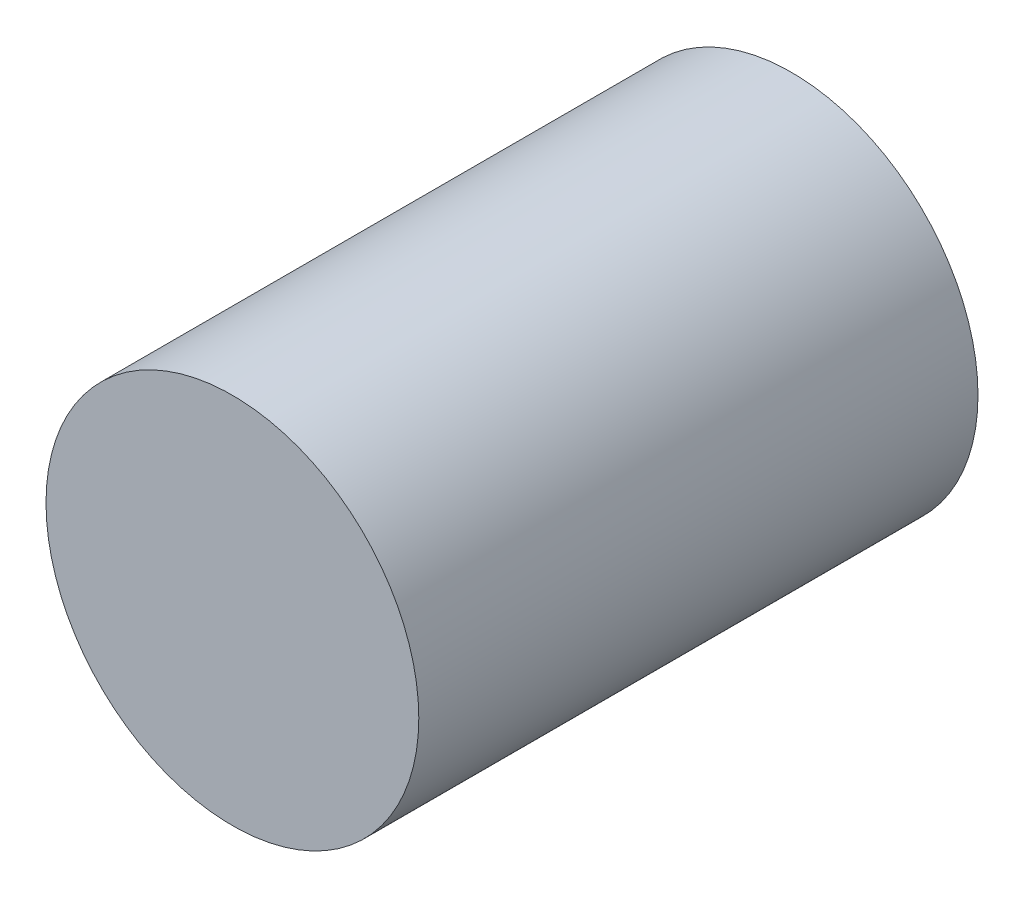
ISO-10303-21;
HEADER;
FILE_DESCRIPTION(('STEP AP214'),'2;1');
FILE_NAME('part.step','',(''),(''),'','','');
FILE_SCHEMA(('AUTOMOTIVE_DESIGN { 1 0 10303 214 1 1 1 1 }'));
ENDSEC;
DATA;
#1=APPLICATION_CONTEXT('core data for automotive mechanical design processes');
#2=APPLICATION_PROTOCOL_DEFINITION('international standard','automotive_design',2000,#1);
#3=PRODUCT_CONTEXT('',#1,'mechanical');
#4=PRODUCT('Part','Part','',(#3));
#5=PRODUCT_RELATED_PRODUCT_CATEGORY('part','',(#4));
#6=PRODUCT_DEFINITION_FORMATION('','',#4);
#7=PRODUCT_DEFINITION_CONTEXT('part definition',#1,'design');
#8=PRODUCT_DEFINITION('design','',#6,#7);
#9=PRODUCT_DEFINITION_SHAPE('','',#8);
#10=(LENGTH_UNIT() NAMED_UNIT(*) SI_UNIT(.MILLI.,.METRE.));
#11=(NAMED_UNIT(*) PLANE_ANGLE_UNIT() SI_UNIT($,.RADIAN.));
#12=(NAMED_UNIT(*) SI_UNIT($,.STERADIAN.) SOLID_ANGLE_UNIT());
#13=UNCERTAINTY_MEASURE_WITH_UNIT(LENGTH_MEASURE(1.E-05),#10,'distance_accuracy_value','');
#14=(GEOMETRIC_REPRESENTATION_CONTEXT(3) GLOBAL_UNCERTAINTY_ASSIGNED_CONTEXT((#13)) GLOBAL_UNIT_ASSIGNED_CONTEXT((#10,
#11,#12)) REPRESENTATION_CONTEXT('',''));
#15=CARTESIAN_POINT('',(0.,0.,0.));
#16=DIRECTION('',(0.,0.,1.));
#17=DIRECTION('',(1.,0.,0.));
#18=AXIS2_PLACEMENT_3D('',#15,#16,#17);
#19=CARTESIAN_POINT('',(0.,-1.80411241501588E-13,15.));
#20=DIRECTION('',(0.,0.,-1.));
#21=DIRECTION('',(-1.00000000000001,0.,0.));
#22=AXIS2_PLACEMENT_3D('',#19,#20,#21);
#23=CYLINDRICAL_SURFACE('',#22,10.);
#24=CARTESIAN_POINT('',(0.,-1.80411241501588E-13,15.));
#25=DIRECTION('',(0.,0.,1.));
#26=DIRECTION('',(1.00000000000001,0.,0.));
#27=AXIS2_PLACEMENT_3D('',#24,#25,#26);
#28=CIRCLE('',#27,10.);
#29=CARTESIAN_POINT('',(10.0000000000002,-1.79856129989275E-13,15.));
#30=VERTEX_POINT('',#29);
#31=EDGE_CURVE('E10',#30,#30,#28,.T.);
#32=ORIENTED_EDGE('',*,*,#31,.F.);
#33=EDGE_LOOP('',(#32));
#34=FACE_BOUND('',#33,.T.);
#35=CARTESIAN_POINT('',(0.,0.,-15.));
#36=DIRECTION('',(0.,0.,1.));
#37=DIRECTION('',(1.00000000000001,0.,0.));
#38=AXIS2_PLACEMENT_3D('',#35,#36,#37);
#39=CIRCLE('',#38,10.);
#40=CARTESIAN_POINT('',(10.0000000000001,0.,-15.));
#41=VERTEX_POINT('',#40);
#42=EDGE_CURVE('E42',#41,#41,#39,.T.);
#43=ORIENTED_EDGE('',*,*,#42,.T.);
#44=EDGE_LOOP('',(#43));
#45=FACE_BOUND('',#44,.T.);
#46=ADVANCED_FACE('F39',(#34,#45),#23,.T.);
#47=CARTESIAN_POINT('',(0.,-1.80411241501588E-13,15.));
#48=DIRECTION('',(0.,0.,1.));
#49=DIRECTION('',(1.00000000000001,0.,0.));
#50=AXIS2_PLACEMENT_3D('',#47,#48,#49);
#51=PLANE('',#50);
#52=ORIENTED_EDGE('',*,*,#31,.T.);
#53=EDGE_LOOP('',(#52));
#54=FACE_BOUND('',#53,.T.);
#55=ADVANCED_FACE('F58',(#54),#51,.T.);
#56=CARTESIAN_POINT('',(0.,0.,-15.));
#57=DIRECTION('',(0.,0.,1.));
#58=DIRECTION('',(1.00000000000001,0.,0.));
#59=AXIS2_PLACEMENT_3D('',#56,#57,#58);
#60=PLANE('',#59);
#61=ORIENTED_EDGE('',*,*,#42,.F.);
#62=EDGE_LOOP('',(#61));
#63=FACE_BOUND('',#62,.T.);
#64=ADVANCED_FACE('F56',(#63),#60,.F.);
#65=CLOSED_SHELL('',(#46,#55,#64));
#66=MANIFOLD_SOLID_BREP('B2',#65);
#67=ADVANCED_BREP_SHAPE_REPRESENTATION('',(#18,#66),#14);
#68=SHAPE_DEFINITION_REPRESENTATION(#9,#67);
ENDSEC;
END-ISO-10303-21;
